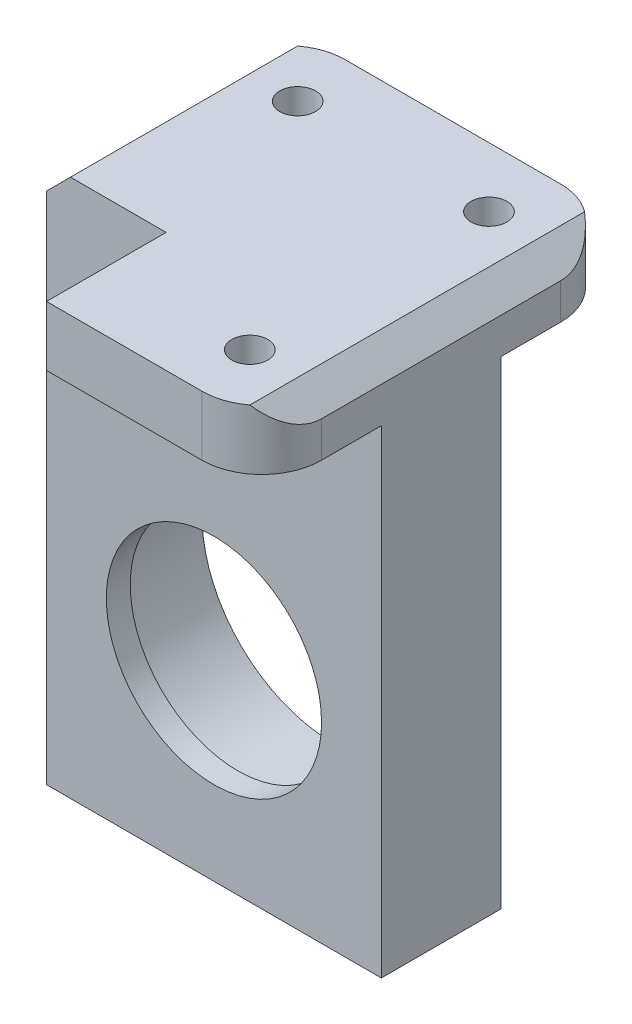
ISO-10303-21;
HEADER;
FILE_DESCRIPTION(('STEP AP214'),'2;1');
FILE_NAME('part.step','',(''),(''),'','','');
FILE_SCHEMA(('AUTOMOTIVE_DESIGN { 1 0 10303 214 1 1 1 1 }'));
ENDSEC;
DATA;
#1=APPLICATION_CONTEXT('core data for automotive mechanical design processes');
#2=APPLICATION_PROTOCOL_DEFINITION('international standard','automotive_design',2000,#1);
#3=PRODUCT_CONTEXT('',#1,'mechanical');
#4=PRODUCT('Part','Part','',(#3));
#5=PRODUCT_RELATED_PRODUCT_CATEGORY('part','',(#4));
#6=PRODUCT_DEFINITION_FORMATION('','',#4);
#7=PRODUCT_DEFINITION_CONTEXT('part definition',#1,'design');
#8=PRODUCT_DEFINITION('design','',#6,#7);
#9=PRODUCT_DEFINITION_SHAPE('','',#8);
#10=(LENGTH_UNIT() NAMED_UNIT(*) SI_UNIT(.MILLI.,.METRE.));
#11=(NAMED_UNIT(*) PLANE_ANGLE_UNIT() SI_UNIT($,.RADIAN.));
#12=(NAMED_UNIT(*) SI_UNIT($,.STERADIAN.) SOLID_ANGLE_UNIT());
#13=UNCERTAINTY_MEASURE_WITH_UNIT(LENGTH_MEASURE(1.E-05),#10,'distance_accuracy_value','');
#14=(GEOMETRIC_REPRESENTATION_CONTEXT(3) GLOBAL_UNCERTAINTY_ASSIGNED_CONTEXT((#13)) GLOBAL_UNIT_ASSIGNED_CONTEXT((#10,
#11,#12)) REPRESENTATION_CONTEXT('',''));
#15=CARTESIAN_POINT('',(0.,0.,0.));
#16=DIRECTION('',(0.,0.,1.));
#17=DIRECTION('',(1.,0.,0.));
#18=AXIS2_PLACEMENT_3D('',#15,#16,#17);
#19=CARTESIAN_POINT('',(14.,29.,10.));
#20=DIRECTION('',(0.,-1.,0.));
#21=DIRECTION('',(1.,0.,0.));
#22=AXIS2_PLACEMENT_3D('',#19,#20,#21);
#23=PLANE('',#22);
#24=CARTESIAN_POINT('',(8.,29.,-5.));
#25=DIRECTION('',(0.,1.,0.));
#26=DIRECTION('',(1.,0.,0.));
#27=AXIS2_PLACEMENT_3D('',#24,#25,#26);
#28=CIRCLE('',#27,1.5);
#29=CARTESIAN_POINT('',(9.5,29.,-5.));
#30=VERTEX_POINT('',#29);
#31=EDGE_CURVE('E183',#30,#30,#28,.T.);
#32=ORIENTED_EDGE('',*,*,#31,.F.);
#33=EDGE_LOOP('',(#32));
#34=FACE_BOUND('',#33,.T.);
#35=CARTESIAN_POINT('',(-8.,29.,-5.));
#36=DIRECTION('',(0.,1.,0.));
#37=DIRECTION('',(-1.,0.,0.));
#38=AXIS2_PLACEMENT_3D('',#35,#36,#37);
#39=CIRCLE('',#38,1.5);
#40=CARTESIAN_POINT('',(-9.5,29.,-5.));
#41=VERTEX_POINT('',#40);
#42=EDGE_CURVE('E284',#41,#41,#39,.T.);
#43=ORIENTED_EDGE('',*,*,#42,.F.);
#44=EDGE_LOOP('',(#43));
#45=FACE_BOUND('',#44,.T.);
#46=CARTESIAN_POINT('',(8.,29.,15.));
#47=DIRECTION('',(0.,1.,0.));
#48=DIRECTION('',(-1.,0.,0.));
#49=AXIS2_PLACEMENT_3D('',#46,#47,#48);
#50=CIRCLE('',#49,1.5);
#51=CARTESIAN_POINT('',(6.5,29.,15.));
#52=VERTEX_POINT('',#51);
#53=EDGE_CURVE('E169',#52,#52,#50,.T.);
#54=ORIENTED_EDGE('',*,*,#53,.F.);
#55=EDGE_LOOP('',(#54));
#56=FACE_BOUND('',#55,.T.);
#57=DIRECTION('',(0.,0.,-1.));
#58=VECTOR('',#57,1.);
#59=CARTESIAN_POINT('',(-4.,29.,10.));
#60=LINE('',#59,#58);
#61=CARTESIAN_POINT('',(-4.,29.,20.));
#62=VERTEX_POINT('',#61);
#63=CARTESIAN_POINT('',(-4.,29.,10.));
#64=VERTEX_POINT('',#63);
#65=EDGE_CURVE('E148',#62,#64,#60,.T.);
#66=ORIENTED_EDGE('',*,*,#65,.F.);
#67=DIRECTION('',(1.,0.,0.));
#68=VECTOR('',#67,1.);
#69=CARTESIAN_POINT('',(-9.,29.,20.));
#70=LINE('',#69,#68);
#71=CARTESIAN_POINT('',(8.99999999999996,29.,20.));
#72=VERTEX_POINT('',#71);
#73=EDGE_CURVE('E156',#62,#72,#70,.T.);
#74=ORIENTED_EDGE('',*,*,#73,.T.);
#75=CARTESIAN_POINT('',(9.,29.,15.));
#76=DIRECTION('',(0.,1.,0.));
#77=DIRECTION('',(-1.,0.,0.));
#78=AXIS2_PLACEMENT_3D('',#75,#76,#77);
#79=CIRCLE('',#78,5.);
#80=CARTESIAN_POINT('',(12.,29.,19.));
#81=VERTEX_POINT('',#80);
#82=EDGE_CURVE('E164',#72,#81,#79,.T.);
#83=ORIENTED_EDGE('',*,*,#82,.T.);
#84=DIRECTION('',(0.,0.,1.));
#85=VECTOR('',#84,1.);
#86=CARTESIAN_POINT('',(12.,29.,-10.001));
#87=LINE('',#86,#85);
#88=CARTESIAN_POINT('',(12.,29.,-9.00000000000001));
#89=VERTEX_POINT('',#88);
#90=EDGE_CURVE('E64',#89,#81,#87,.T.);
#91=ORIENTED_EDGE('',*,*,#90,.F.);
#92=CARTESIAN_POINT('',(9.,29.,-5.));
#93=DIRECTION('',(0.,1.,0.));
#94=DIRECTION('',(1.,0.,0.));
#95=AXIS2_PLACEMENT_3D('',#92,#93,#94);
#96=CIRCLE('',#95,5.);
#97=CARTESIAN_POINT('',(8.99999999999996,29.,-10.));
#98=VERTEX_POINT('',#97);
#99=EDGE_CURVE('E288',#89,#98,#96,.T.);
#100=ORIENTED_EDGE('',*,*,#99,.T.);
#101=DIRECTION('',(-1.,0.,0.));
#102=VECTOR('',#101,1.);
#103=CARTESIAN_POINT('',(-9.,29.,-10.));
#104=LINE('',#103,#102);
#105=CARTESIAN_POINT('',(-9.,29.,-10.));
#106=VERTEX_POINT('',#105);
#107=EDGE_CURVE('E303',#98,#106,#104,.T.);
#108=ORIENTED_EDGE('',*,*,#107,.T.);
#109=CARTESIAN_POINT('',(-9.,29.,-5.));
#110=DIRECTION('',(0.,1.,0.));
#111=DIRECTION('',(1.,0.,0.));
#112=AXIS2_PLACEMENT_3D('',#109,#110,#111);
#113=CIRCLE('',#112,5.);
#114=CARTESIAN_POINT('',(-12.,29.,-8.99999999999997));
#115=VERTEX_POINT('',#114);
#116=EDGE_CURVE('E259',#106,#115,#113,.T.);
#117=ORIENTED_EDGE('',*,*,#116,.T.);
#118=DIRECTION('',(0.,0.,1.));
#119=VECTOR('',#118,1.);
#120=CARTESIAN_POINT('',(-12.,29.,-10.001));
#121=LINE('',#120,#119);
#122=CARTESIAN_POINT('',(-12.,29.,10.));
#123=VERTEX_POINT('',#122);
#124=EDGE_CURVE('E241',#115,#123,#121,.T.);
#125=ORIENTED_EDGE('',*,*,#124,.T.);
#126=DIRECTION('',(-1.,0.,0.));
#127=VECTOR('',#126,1.);
#128=CARTESIAN_POINT('',(-14.,29.,10.));
#129=LINE('',#128,#127);
#130=EDGE_CURVE('E57',#64,#123,#129,.T.);
#131=ORIENTED_EDGE('',*,*,#130,.F.);
#132=EDGE_LOOP('',(#66,#74,#83,#91,#100,#108,#117,#125,#131));
#133=FACE_BOUND('',#132,.T.);
#134=ADVANCED_FACE('F41',(#34,#45,#56,#133),#23,.F.);
#135=CARTESIAN_POINT('',(-9.,24.,15.));
#136=DIRECTION('',(0.,1.,0.));
#137=DIRECTION('',(-1.,0.,0.));
#138=AXIS2_PLACEMENT_3D('',#135,#136,#137);
#139=PLANE('',#138);
#140=CARTESIAN_POINT('',(8.,24.,15.));
#141=DIRECTION('',(0.,1.,0.));
#142=DIRECTION('',(-1.,0.,0.));
#143=AXIS2_PLACEMENT_3D('',#140,#141,#142);
#144=CIRCLE('',#143,1.5);
#145=CARTESIAN_POINT('',(6.5,24.,15.));
#146=VERTEX_POINT('',#145);
#147=EDGE_CURVE('E163',#146,#146,#144,.T.);
#148=ORIENTED_EDGE('',*,*,#147,.T.);
#149=EDGE_LOOP('',(#148));
#150=FACE_BOUND('',#149,.T.);
#151=DIRECTION('',(0.,0.,1.));
#152=VECTOR('',#151,1.);
#153=CARTESIAN_POINT('',(-4.,24.,10.));
#154=LINE('',#153,#152);
#155=CARTESIAN_POINT('',(-4.,24.,10.));
#156=VERTEX_POINT('',#155);
#157=CARTESIAN_POINT('',(-4.,24.,20.));
#158=VERTEX_POINT('',#157);
#159=EDGE_CURVE('E146',#156,#158,#154,.T.);
#160=ORIENTED_EDGE('',*,*,#159,.F.);
#161=DIRECTION('',(-1.,0.,0.));
#162=VECTOR('',#161,1.);
#163=CARTESIAN_POINT('',(-14.,24.,10.));
#164=LINE('',#163,#162);
#165=CARTESIAN_POINT('',(14.,24.,10.));
#166=VERTEX_POINT('',#165);
#167=EDGE_CURVE('E174',#166,#156,#164,.T.);
#168=ORIENTED_EDGE('',*,*,#167,.F.);
#169=DIRECTION('',(0.,0.,-1.));
#170=VECTOR('',#169,1.);
#171=CARTESIAN_POINT('',(14.,24.,10.));
#172=LINE('',#171,#170);
#173=CARTESIAN_POINT('',(14.,24.,15.));
#174=VERTEX_POINT('',#173);
#175=EDGE_CURVE('E180',#174,#166,#172,.T.);
#176=ORIENTED_EDGE('',*,*,#175,.F.);
#177=CARTESIAN_POINT('',(9.,24.,15.));
#178=DIRECTION('',(0.,1.,0.));
#179=DIRECTION('',(-1.,0.,0.));
#180=AXIS2_PLACEMENT_3D('',#177,#178,#179);
#181=CIRCLE('',#180,5.);
#182=CARTESIAN_POINT('',(8.99999999999996,24.,20.));
#183=VERTEX_POINT('',#182);
#184=EDGE_CURVE('E178',#183,#174,#181,.T.);
#185=ORIENTED_EDGE('',*,*,#184,.F.);
#186=DIRECTION('',(1.,0.,0.));
#187=VECTOR('',#186,1.);
#188=CARTESIAN_POINT('',(-9.,24.,20.));
#189=LINE('',#188,#187);
#190=EDGE_CURVE('E168',#158,#183,#189,.T.);
#191=ORIENTED_EDGE('',*,*,#190,.F.);
#192=EDGE_LOOP('',(#160,#168,#176,#185,#191));
#193=FACE_BOUND('',#192,.T.);
#194=ADVANCED_FACE('F325',(#150,#193),#139,.F.);
#195=CARTESIAN_POINT('',(-12.,29.,-10.001));
#196=DIRECTION('',(0.707106781186548,-0.707106781186547,0.));
#197=DIRECTION('',(0.707106781186547,0.707106781186548,0.));
#198=AXIS2_PLACEMENT_3D('',#195,#196,#197);
#199=PLANE('',#198);
#200=DIRECTION('',(-0.707106781186547,-0.707106781186548,0.));
#201=VECTOR('',#200,1.);
#202=CARTESIAN_POINT('',(-35.5005,5.4995,10.));
#203=LINE('',#202,#201);
#204=CARTESIAN_POINT('',(-14.,27.,10.));
#205=VERTEX_POINT('',#204);
#206=EDGE_CURVE('E231',#123,#205,#203,.T.);
#207=ORIENTED_EDGE('',*,*,#206,.F.);
#208=ORIENTED_EDGE('',*,*,#124,.F.);
#209=CARTESIAN_POINT('',(-9.,32.,-5.));
#210=DIRECTION('',(0.707106781186548,-0.707106781186547,0.));
#211=DIRECTION('',(0.707106781186547,0.707106781186548,0.));
#212=AXIS2_PLACEMENT_3D('',#209,#210,#211);
#213=ELLIPSE('',#212,7.07106781186548,5.);
#214=CARTESIAN_POINT('',(-14.,27.,-5.));
#215=VERTEX_POINT('',#214);
#216=EDGE_CURVE('E248',#215,#115,#213,.T.);
#217=ORIENTED_EDGE('',*,*,#216,.F.);
#218=DIRECTION('',(0.,0.,1.));
#219=VECTOR('',#218,1.);
#220=CARTESIAN_POINT('',(-14.,27.,-10.001));
#221=LINE('',#220,#219);
#222=EDGE_CURVE('E236',#215,#205,#221,.T.);
#223=ORIENTED_EDGE('',*,*,#222,.T.);
#224=EDGE_LOOP('',(#207,#208,#217,#223));
#225=FACE_BOUND('',#224,.T.);
#226=ADVANCED_FACE('F341',(#225),#199,.F.);
#227=CARTESIAN_POINT('',(-14.,-16.,10.));
#228=DIRECTION('',(1.,0.,0.));
#229=DIRECTION('',(0.,0.,-1.));
#230=AXIS2_PLACEMENT_3D('',#227,#228,#229);
#231=PLANE('',#230);
#232=DIRECTION('',(0.,-1.,0.));
#233=VECTOR('',#232,1.);
#234=CARTESIAN_POINT('',(-14.,-16.,10.));
#235=LINE('',#234,#233);
#236=CARTESIAN_POINT('',(-14.,-16.,10.));
#237=VERTEX_POINT('',#236);
#238=EDGE_CURVE('E208',#205,#237,#235,.T.);
#239=ORIENTED_EDGE('',*,*,#238,.F.);
#240=ORIENTED_EDGE('',*,*,#222,.F.);
#241=DIRECTION('',(0.,1.,0.));
#242=VECTOR('',#241,1.);
#243=CARTESIAN_POINT('',(-14.,24.,-5.));
#244=LINE('',#243,#242);
#245=CARTESIAN_POINT('',(-14.,24.,-5.));
#246=VERTEX_POINT('',#245);
#247=EDGE_CURVE('E191',#246,#215,#244,.T.);
#248=ORIENTED_EDGE('',*,*,#247,.F.);
#249=DIRECTION('',(0.,0.,1.));
#250=VECTOR('',#249,1.);
#251=CARTESIAN_POINT('',(-14.,24.,0.));
#252=LINE('',#251,#250);
#253=CARTESIAN_POINT('',(-14.,24.,0.));
#254=VERTEX_POINT('',#253);
#255=EDGE_CURVE('E291',#246,#254,#252,.T.);
#256=ORIENTED_EDGE('',*,*,#255,.T.);
#257=DIRECTION('',(0.,-1.,0.));
#258=VECTOR('',#257,1.);
#259=CARTESIAN_POINT('',(-14.,-16.,0.));
#260=LINE('',#259,#258);
#261=CARTESIAN_POINT('',(-14.,-16.,0.));
#262=VERTEX_POINT('',#261);
#263=EDGE_CURVE('E202',#254,#262,#260,.T.);
#264=ORIENTED_EDGE('',*,*,#263,.T.);
#265=DIRECTION('',(0.,0.,-1.));
#266=VECTOR('',#265,1.);
#267=CARTESIAN_POINT('',(-14.,-16.,10.));
#268=LINE('',#267,#266);
#269=EDGE_CURVE('E47',#237,#262,#268,.T.);
#270=ORIENTED_EDGE('',*,*,#269,.F.);
#271=EDGE_LOOP('',(#239,#240,#248,#256,#264,#270));
#272=FACE_BOUND('',#271,.T.);
#273=ADVANCED_FACE('F240',(#272),#231,.F.);
#274=CARTESIAN_POINT('',(-9.,24.,-5.));
#275=DIRECTION('',(0.,1.,0.));
#276=DIRECTION('',(-1.,0.,0.));
#277=AXIS2_PLACEMENT_3D('',#274,#275,#276);
#278=CYLINDRICAL_SURFACE('',#277,5.);
#279=ORIENTED_EDGE('',*,*,#247,.T.);
#280=ORIENTED_EDGE('',*,*,#216,.T.);
#281=ORIENTED_EDGE('',*,*,#116,.F.);
#282=DIRECTION('',(0.,1.,0.));
#283=VECTOR('',#282,1.);
#284=CARTESIAN_POINT('',(-9.,24.,-10.));
#285=LINE('',#284,#283);
#286=CARTESIAN_POINT('',(-9.,24.,-10.));
#287=VERTEX_POINT('',#286);
#288=EDGE_CURVE('E255',#287,#106,#285,.T.);
#289=ORIENTED_EDGE('',*,*,#288,.F.);
#290=CARTESIAN_POINT('',(-9.,24.,-5.));
#291=DIRECTION('',(0.,1.,0.));
#292=DIRECTION('',(1.,0.,0.));
#293=AXIS2_PLACEMENT_3D('',#290,#291,#292);
#294=CIRCLE('',#293,5.);
#295=EDGE_CURVE('E251',#287,#246,#294,.T.);
#296=ORIENTED_EDGE('',*,*,#295,.T.);
#297=EDGE_LOOP('',(#279,#280,#281,#289,#296));
#298=FACE_BOUND('',#297,.T.);
#299=ADVANCED_FACE('F249',(#298),#278,.T.);
#300=CARTESIAN_POINT('',(9.,24.,-5.));
#301=DIRECTION('',(0.,1.,0.));
#302=DIRECTION('',(-1.,0.,0.));
#303=AXIS2_PLACEMENT_3D('',#300,#301,#302);
#304=CYLINDRICAL_SURFACE('',#303,5.);
#305=ORIENTED_EDGE('',*,*,#99,.F.);
#306=CARTESIAN_POINT('',(9.,32.,-5.));
#307=DIRECTION('',(-0.707106781186548,-0.707106781186547,0.));
#308=DIRECTION('',(-0.707106781186547,0.707106781186548,0.));
#309=AXIS2_PLACEMENT_3D('',#306,#307,#308);
#310=ELLIPSE('',#309,7.07106781186548,5.);
#311=CARTESIAN_POINT('',(14.,27.,-5.));
#312=VERTEX_POINT('',#311);
#313=EDGE_CURVE('E268',#89,#312,#310,.T.);
#314=ORIENTED_EDGE('',*,*,#313,.T.);
#315=DIRECTION('',(0.,1.,0.));
#316=VECTOR('',#315,1.);
#317=CARTESIAN_POINT('',(14.,24.,-4.99999999999996));
#318=LINE('',#317,#316);
#319=CARTESIAN_POINT('',(14.,24.,-4.99999999999996));
#320=VERTEX_POINT('',#319);
#321=EDGE_CURVE('E262',#320,#312,#318,.T.);
#322=ORIENTED_EDGE('',*,*,#321,.F.);
#323=CARTESIAN_POINT('',(9.,24.,-5.));
#324=DIRECTION('',(0.,1.,0.));
#325=DIRECTION('',(1.,0.,0.));
#326=AXIS2_PLACEMENT_3D('',#323,#324,#325);
#327=CIRCLE('',#326,5.);
#328=CARTESIAN_POINT('',(8.99999999999996,24.,-10.));
#329=VERTEX_POINT('',#328);
#330=EDGE_CURVE('E296',#320,#329,#327,.T.);
#331=ORIENTED_EDGE('',*,*,#330,.T.);
#332=DIRECTION('',(0.,1.,0.));
#333=VECTOR('',#332,1.);
#334=CARTESIAN_POINT('',(8.99999999999996,24.,-10.));
#335=LINE('',#334,#333);
#336=EDGE_CURVE('E258',#329,#98,#335,.T.);
#337=ORIENTED_EDGE('',*,*,#336,.T.);
#338=EDGE_LOOP('',(#305,#314,#322,#331,#337));
#339=FACE_BOUND('',#338,.T.);
#340=ADVANCED_FACE('F312',(#339),#304,.T.);
#341=CARTESIAN_POINT('',(9.,24.,15.));
#342=DIRECTION('',(0.,1.,0.));
#343=DIRECTION('',(-1.,0.,0.));
#344=AXIS2_PLACEMENT_3D('',#341,#342,#343);
#345=CYLINDRICAL_SURFACE('',#344,5.);
#346=DIRECTION('',(0.,1.,0.));
#347=VECTOR('',#346,1.);
#348=CARTESIAN_POINT('',(14.,24.,15.));
#349=LINE('',#348,#347);
#350=CARTESIAN_POINT('',(14.,27.,15.));
#351=VERTEX_POINT('',#350);
#352=EDGE_CURVE('E266',#174,#351,#349,.T.);
#353=ORIENTED_EDGE('',*,*,#352,.T.);
#354=CARTESIAN_POINT('',(9.,32.,15.));
#355=DIRECTION('',(-0.707106781186548,-0.707106781186547,0.));
#356=DIRECTION('',(-0.707106781186547,0.707106781186548,0.));
#357=AXIS2_PLACEMENT_3D('',#354,#355,#356);
#358=ELLIPSE('',#357,7.07106781186547,5.);
#359=EDGE_CURVE('E271',#351,#81,#358,.T.);
#360=ORIENTED_EDGE('',*,*,#359,.T.);
#361=ORIENTED_EDGE('',*,*,#82,.F.);
#362=DIRECTION('',(0.,1.,0.));
#363=VECTOR('',#362,1.);
#364=CARTESIAN_POINT('',(8.99999999999996,24.,20.));
#365=LINE('',#364,#363);
#366=EDGE_CURVE('E165',#183,#72,#365,.T.);
#367=ORIENTED_EDGE('',*,*,#366,.F.);
#368=ORIENTED_EDGE('',*,*,#184,.T.);
#369=EDGE_LOOP('',(#353,#360,#361,#367,#368));
#370=FACE_BOUND('',#369,.T.);
#371=ADVANCED_FACE('F322',(#370),#345,.T.);
#372=CARTESIAN_POINT('',(0.,0.,0.));
#373=DIRECTION('',(0.,0.,-1.));
#374=DIRECTION('',(-1.,0.,0.));
#375=AXIS2_PLACEMENT_3D('',#372,#373,#374);
#376=PLANE('',#375);
#377=CARTESIAN_POINT('',(0.,0.,0.));
#378=DIRECTION('',(0.,0.,1.));
#379=DIRECTION('',(1.,0.,0.));
#380=AXIS2_PLACEMENT_3D('',#377,#378,#379);
#381=CIRCLE('',#380,11.);
#382=CARTESIAN_POINT('',(11.,0.,0.));
#383=VERTEX_POINT('',#382);
#384=EDGE_CURVE('E197',#383,#383,#381,.T.);
#385=ORIENTED_EDGE('',*,*,#384,.T.);
#386=EDGE_LOOP('',(#385));
#387=FACE_BOUND('',#386,.T.);
#388=ORIENTED_EDGE('',*,*,#263,.F.);
#389=DIRECTION('',(1.,0.,0.));
#390=VECTOR('',#389,1.);
#391=CARTESIAN_POINT('',(-14.,24.,0.));
#392=LINE('',#391,#390);
#393=CARTESIAN_POINT('',(14.,24.,0.));
#394=VERTEX_POINT('',#393);
#395=EDGE_CURVE('E228',#254,#394,#392,.T.);
#396=ORIENTED_EDGE('',*,*,#395,.T.);
#397=DIRECTION('',(0.,1.,0.));
#398=VECTOR('',#397,1.);
#399=CARTESIAN_POINT('',(14.,-16.,0.));
#400=LINE('',#399,#398);
#401=CARTESIAN_POINT('',(14.,-16.,0.));
#402=VERTEX_POINT('',#401);
#403=EDGE_CURVE('E215',#402,#394,#400,.T.);
#404=ORIENTED_EDGE('',*,*,#403,.F.);
#405=DIRECTION('',(1.,0.,0.));
#406=VECTOR('',#405,1.);
#407=CARTESIAN_POINT('',(14.,-16.,0.));
#408=LINE('',#407,#406);
#409=EDGE_CURVE('E199',#262,#402,#408,.T.);
#410=ORIENTED_EDGE('',*,*,#409,.F.);
#411=EDGE_LOOP('',(#388,#396,#404,#410));
#412=FACE_BOUND('',#411,.T.);
#413=ADVANCED_FACE('F221',(#387,#412),#376,.T.);
#414=CARTESIAN_POINT('',(0.,0.,10.));
#415=DIRECTION('',(0.,0.,-1.));
#416=DIRECTION('',(-1.,0.,0.));
#417=AXIS2_PLACEMENT_3D('',#414,#415,#416);
#418=CYLINDRICAL_SURFACE('',#417,11.);
#419=ORIENTED_EDGE('',*,*,#384,.F.);
#420=EDGE_LOOP('',(#419));
#421=FACE_BOUND('',#420,.T.);
#422=CARTESIAN_POINT('',(0.,0.,8.));
#423=DIRECTION('',(0.,0.,1.));
#424=DIRECTION('',(1.,0.,0.));
#425=AXIS2_PLACEMENT_3D('',#422,#423,#424);
#426=CIRCLE('',#425,11.);
#427=CARTESIAN_POINT('',(11.,0.,8.));
#428=VERTEX_POINT('',#427);
#429=EDGE_CURVE('E187',#428,#428,#426,.T.);
#430=ORIENTED_EDGE('',*,*,#429,.T.);
#431=EDGE_LOOP('',(#430));
#432=FACE_BOUND('',#431,.T.);
#433=ADVANCED_FACE('F365',(#421,#432),#418,.F.);
#434=CARTESIAN_POINT('',(0.,0.,10.));
#435=DIRECTION('',(0.,0.,-1.));
#436=DIRECTION('',(-1.,0.,0.));
#437=AXIS2_PLACEMENT_3D('',#434,#435,#436);
#438=PLANE('',#437);
#439=DIRECTION('',(0.,1.,0.));
#440=VECTOR('',#439,1.);
#441=CARTESIAN_POINT('',(14.,-16.,10.));
#442=LINE('',#441,#440);
#443=CARTESIAN_POINT('',(14.,-16.,10.));
#444=VERTEX_POINT('',#443);
#445=EDGE_CURVE('E204',#444,#166,#442,.T.);
#446=ORIENTED_EDGE('',*,*,#445,.T.);
#447=ORIENTED_EDGE('',*,*,#167,.T.);
#448=DIRECTION('',(0.,1.,0.));
#449=VECTOR('',#448,1.);
#450=CARTESIAN_POINT('',(-4.00000000000001,-16.001,10.));
#451=LINE('',#450,#449);
#452=EDGE_CURVE('E155',#156,#64,#451,.T.);
#453=ORIENTED_EDGE('',*,*,#452,.T.);
#454=ORIENTED_EDGE('',*,*,#130,.T.);
#455=ORIENTED_EDGE('',*,*,#206,.T.);
#456=ORIENTED_EDGE('',*,*,#238,.T.);
#457=DIRECTION('',(1.,0.,0.));
#458=VECTOR('',#457,1.);
#459=CARTESIAN_POINT('',(14.,-16.,10.));
#460=LINE('',#459,#458);
#461=EDGE_CURVE('E203',#237,#444,#460,.T.);
#462=ORIENTED_EDGE('',*,*,#461,.T.);
#463=EDGE_LOOP('',(#446,#447,#453,#454,#455,#456,#462));
#464=FACE_BOUND('',#463,.T.);
#465=CARTESIAN_POINT('',(0.,0.,10.));
#466=DIRECTION('',(0.,0.,1.));
#467=DIRECTION('',(1.,0.,0.));
#468=AXIS2_PLACEMENT_3D('',#465,#466,#467);
#469=CIRCLE('',#468,9.);
#470=CARTESIAN_POINT('',(9.,0.,10.));
#471=VERTEX_POINT('',#470);
#472=EDGE_CURVE('E192',#471,#471,#469,.T.);
#473=ORIENTED_EDGE('',*,*,#472,.F.);
#474=EDGE_LOOP('',(#473));
#475=FACE_BOUND('',#474,.T.);
#476=ADVANCED_FACE('F235',(#464,#475),#438,.F.);
#477=CARTESIAN_POINT('',(14.,-16.,10.));
#478=DIRECTION('',(0.,1.,0.));
#479=DIRECTION('',(-1.,0.,0.));
#480=AXIS2_PLACEMENT_3D('',#477,#478,#479);
#481=PLANE('',#480);
#482=ORIENTED_EDGE('',*,*,#409,.T.);
#483=DIRECTION('',(0.,0.,-1.));
#484=VECTOR('',#483,1.);
#485=CARTESIAN_POINT('',(14.,-16.,10.));
#486=LINE('',#485,#484);
#487=EDGE_CURVE('E11',#444,#402,#486,.T.);
#488=ORIENTED_EDGE('',*,*,#487,.F.);
#489=ORIENTED_EDGE('',*,*,#461,.F.);
#490=ORIENTED_EDGE('',*,*,#269,.T.);
#491=EDGE_LOOP('',(#482,#488,#489,#490));
#492=FACE_BOUND('',#491,.T.);
#493=ADVANCED_FACE('F43',(#492),#481,.F.);
#494=CARTESIAN_POINT('',(14.,-16.,10.));
#495=DIRECTION('',(-1.,0.,0.));
#496=DIRECTION('',(0.,0.,1.));
#497=AXIS2_PLACEMENT_3D('',#494,#495,#496);
#498=PLANE('',#497);
#499=ORIENTED_EDGE('',*,*,#321,.T.);
#500=DIRECTION('',(0.,0.,1.));
#501=VECTOR('',#500,1.);
#502=CARTESIAN_POINT('',(14.,27.,-10.001));
#503=LINE('',#502,#501);
#504=EDGE_CURVE('E274',#312,#351,#503,.T.);
#505=ORIENTED_EDGE('',*,*,#504,.T.);
#506=ORIENTED_EDGE('',*,*,#352,.F.);
#507=ORIENTED_EDGE('',*,*,#175,.T.);
#508=ORIENTED_EDGE('',*,*,#445,.F.);
#509=ORIENTED_EDGE('',*,*,#487,.T.);
#510=ORIENTED_EDGE('',*,*,#403,.T.);
#511=DIRECTION('',(0.,0.,-1.));
#512=VECTOR('',#511,1.);
#513=CARTESIAN_POINT('',(14.,24.,0.));
#514=LINE('',#513,#512);
#515=EDGE_CURVE('E298',#394,#320,#514,.T.);
#516=ORIENTED_EDGE('',*,*,#515,.T.);
#517=EDGE_LOOP('',(#499,#505,#506,#507,#508,#509,#510,#516));
#518=FACE_BOUND('',#517,.T.);
#519=ADVANCED_FACE('F227',(#518),#498,.F.);
#520=CARTESIAN_POINT('',(0.,0.,8.));
#521=DIRECTION('',(0.,0.,1.));
#522=DIRECTION('',(1.,0.,0.));
#523=AXIS2_PLACEMENT_3D('',#520,#521,#522);
#524=PLANE('',#523);
#525=CARTESIAN_POINT('',(0.,0.,8.));
#526=DIRECTION('',(0.,0.,1.));
#527=DIRECTION('',(1.,0.,0.));
#528=AXIS2_PLACEMENT_3D('',#525,#526,#527);
#529=CIRCLE('',#528,9.);
#530=CARTESIAN_POINT('',(9.,0.,8.));
#531=VERTEX_POINT('',#530);
#532=EDGE_CURVE('E190',#531,#531,#529,.T.);
#533=ORIENTED_EDGE('',*,*,#532,.T.);
#534=EDGE_LOOP('',(#533));
#535=FACE_BOUND('',#534,.T.);
#536=ORIENTED_EDGE('',*,*,#429,.F.);
#537=EDGE_LOOP('',(#536));
#538=FACE_BOUND('',#537,.T.);
#539=ADVANCED_FACE('F353',(#535,#538),#524,.F.);
#540=CARTESIAN_POINT('',(0.,0.,8.));
#541=DIRECTION('',(0.,0.,1.));
#542=DIRECTION('',(1.,0.,0.));
#543=AXIS2_PLACEMENT_3D('',#540,#541,#542);
#544=CYLINDRICAL_SURFACE('',#543,9.);
#545=ORIENTED_EDGE('',*,*,#532,.F.);
#546=EDGE_LOOP('',(#545));
#547=FACE_BOUND('',#546,.T.);
#548=ORIENTED_EDGE('',*,*,#472,.T.);
#549=EDGE_LOOP('',(#548));
#550=FACE_BOUND('',#549,.T.);
#551=ADVANCED_FACE('F357',(#547,#550),#544,.F.);
#552=CARTESIAN_POINT('',(-9.,24.,-10.));
#553=DIRECTION('',(0.,0.,-1.));
#554=DIRECTION('',(-1.,0.,0.));
#555=AXIS2_PLACEMENT_3D('',#552,#553,#554);
#556=PLANE('',#555);
#557=ORIENTED_EDGE('',*,*,#107,.F.);
#558=ORIENTED_EDGE('',*,*,#336,.F.);
#559=DIRECTION('',(-1.,0.,0.));
#560=VECTOR('',#559,1.);
#561=CARTESIAN_POINT('',(-9.,24.,-10.));
#562=LINE('',#561,#560);
#563=EDGE_CURVE('E302',#329,#287,#562,.T.);
#564=ORIENTED_EDGE('',*,*,#563,.T.);
#565=ORIENTED_EDGE('',*,*,#288,.T.);
#566=EDGE_LOOP('',(#557,#558,#564,#565));
#567=FACE_BOUND('',#566,.T.);
#568=ADVANCED_FACE('F309',(#567),#556,.T.);
#569=CARTESIAN_POINT('',(-9.,24.,-5.));
#570=DIRECTION('',(0.,-1.,0.));
#571=DIRECTION('',(1.,0.,0.));
#572=AXIS2_PLACEMENT_3D('',#569,#570,#571);
#573=PLANE('',#572);
#574=CARTESIAN_POINT('',(8.,24.,-5.));
#575=DIRECTION('',(0.,1.,0.));
#576=DIRECTION('',(1.,0.,0.));
#577=AXIS2_PLACEMENT_3D('',#574,#575,#576);
#578=CIRCLE('',#577,1.5);
#579=CARTESIAN_POINT('',(9.5,24.,-5.));
#580=VERTEX_POINT('',#579);
#581=EDGE_CURVE('E283',#580,#580,#578,.T.);
#582=ORIENTED_EDGE('',*,*,#581,.T.);
#583=EDGE_LOOP('',(#582));
#584=FACE_BOUND('',#583,.T.);
#585=CARTESIAN_POINT('',(-8.,24.,-5.));
#586=DIRECTION('',(0.,1.,0.));
#587=DIRECTION('',(-1.,0.,0.));
#588=AXIS2_PLACEMENT_3D('',#585,#586,#587);
#589=CIRCLE('',#588,1.5);
#590=CARTESIAN_POINT('',(-9.5,24.,-5.));
#591=VERTEX_POINT('',#590);
#592=EDGE_CURVE('E290',#591,#591,#589,.T.);
#593=ORIENTED_EDGE('',*,*,#592,.T.);
#594=EDGE_LOOP('',(#593));
#595=FACE_BOUND('',#594,.T.);
#596=ORIENTED_EDGE('',*,*,#255,.F.);
#597=ORIENTED_EDGE('',*,*,#295,.F.);
#598=ORIENTED_EDGE('',*,*,#563,.F.);
#599=ORIENTED_EDGE('',*,*,#330,.F.);
#600=ORIENTED_EDGE('',*,*,#515,.F.);
#601=ORIENTED_EDGE('',*,*,#395,.F.);
#602=EDGE_LOOP('',(#596,#597,#598,#599,#600,#601));
#603=FACE_BOUND('',#602,.T.);
#604=ADVANCED_FACE('F311',(#584,#595,#603),#573,.T.);
#605=CARTESIAN_POINT('',(-8.,24.,-5.));
#606=DIRECTION('',(0.,1.,0.));
#607=DIRECTION('',(-1.,0.,0.));
#608=AXIS2_PLACEMENT_3D('',#605,#606,#607);
#609=CYLINDRICAL_SURFACE('',#608,1.5);
#610=ORIENTED_EDGE('',*,*,#592,.F.);
#611=EDGE_LOOP('',(#610));
#612=FACE_BOUND('',#611,.T.);
#613=ORIENTED_EDGE('',*,*,#42,.T.);
#614=EDGE_LOOP('',(#613));
#615=FACE_BOUND('',#614,.T.);
#616=ADVANCED_FACE('F396',(#612,#615),#609,.F.);
#617=CARTESIAN_POINT('',(8.,24.,-5.));
#618=DIRECTION('',(0.,1.,0.));
#619=DIRECTION('',(-1.,0.,0.));
#620=AXIS2_PLACEMENT_3D('',#617,#618,#619);
#621=CYLINDRICAL_SURFACE('',#620,1.5);
#622=ORIENTED_EDGE('',*,*,#581,.F.);
#623=EDGE_LOOP('',(#622));
#624=FACE_BOUND('',#623,.T.);
#625=ORIENTED_EDGE('',*,*,#31,.T.);
#626=EDGE_LOOP('',(#625));
#627=FACE_BOUND('',#626,.T.);
#628=ADVANCED_FACE('F410',(#624,#627),#621,.F.);
#629=CARTESIAN_POINT('',(-9.,24.,20.));
#630=DIRECTION('',(0.,0.,1.));
#631=DIRECTION('',(1.,0.,0.));
#632=AXIS2_PLACEMENT_3D('',#629,#630,#631);
#633=PLANE('',#632);
#634=DIRECTION('',(0.,1.,0.));
#635=VECTOR('',#634,1.);
#636=CARTESIAN_POINT('',(-4.00000000000001,-16.001,20.));
#637=LINE('',#636,#635);
#638=EDGE_CURVE('E141',#158,#62,#637,.T.);
#639=ORIENTED_EDGE('',*,*,#638,.F.);
#640=ORIENTED_EDGE('',*,*,#190,.T.);
#641=ORIENTED_EDGE('',*,*,#366,.T.);
#642=ORIENTED_EDGE('',*,*,#73,.F.);
#643=EDGE_LOOP('',(#639,#640,#641,#642));
#644=FACE_BOUND('',#643,.T.);
#645=ADVANCED_FACE('F159',(#644),#633,.T.);
#646=CARTESIAN_POINT('',(8.,24.,15.));
#647=DIRECTION('',(0.,1.,0.));
#648=DIRECTION('',(-1.,0.,0.));
#649=AXIS2_PLACEMENT_3D('',#646,#647,#648);
#650=CYLINDRICAL_SURFACE('',#649,1.5);
#651=ORIENTED_EDGE('',*,*,#147,.F.);
#652=EDGE_LOOP('',(#651));
#653=FACE_BOUND('',#652,.T.);
#654=ORIENTED_EDGE('',*,*,#53,.T.);
#655=EDGE_LOOP('',(#654));
#656=FACE_BOUND('',#655,.T.);
#657=ADVANCED_FACE('F330',(#653,#656),#650,.F.);
#658=CARTESIAN_POINT('',(12.,29.,-10.001));
#659=DIRECTION('',(-0.707106781186548,-0.707106781186547,0.));
#660=DIRECTION('',(0.707106781186547,-0.707106781186548,0.));
#661=AXIS2_PLACEMENT_3D('',#658,#659,#660);
#662=PLANE('',#661);
#663=ORIENTED_EDGE('',*,*,#90,.T.);
#664=ORIENTED_EDGE('',*,*,#359,.F.);
#665=ORIENTED_EDGE('',*,*,#504,.F.);
#666=ORIENTED_EDGE('',*,*,#313,.F.);
#667=EDGE_LOOP('',(#663,#664,#665,#666));
#668=FACE_BOUND('',#667,.T.);
#669=ADVANCED_FACE('F324',(#668),#662,.F.);
#670=CARTESIAN_POINT('',(-4.00000000000001,-16.001,10.));
#671=DIRECTION('',(1.,0.,0.));
#672=DIRECTION('',(0.,0.,-1.));
#673=AXIS2_PLACEMENT_3D('',#670,#671,#672);
#674=PLANE('',#673);
#675=ORIENTED_EDGE('',*,*,#159,.T.);
#676=ORIENTED_EDGE('',*,*,#638,.T.);
#677=ORIENTED_EDGE('',*,*,#65,.T.);
#678=ORIENTED_EDGE('',*,*,#452,.F.);
#679=EDGE_LOOP('',(#675,#676,#677,#678));
#680=FACE_BOUND('',#679,.T.);
#681=ADVANCED_FACE('F144',(#680),#674,.F.);
#682=CLOSED_SHELL('',(#134,#194,#226,#273,#299,#340,#371,#413,#433,#476,#493,#519,#539,#551,
#568,#604,#616,#628,#645,#657,#669,#681));
#683=MANIFOLD_SOLID_BREP('B2',#682);
#684=ADVANCED_BREP_SHAPE_REPRESENTATION('',(#18,#683),#14);
#685=SHAPE_DEFINITION_REPRESENTATION(#9,#684);
ENDSEC;
END-ISO-10303-21;
